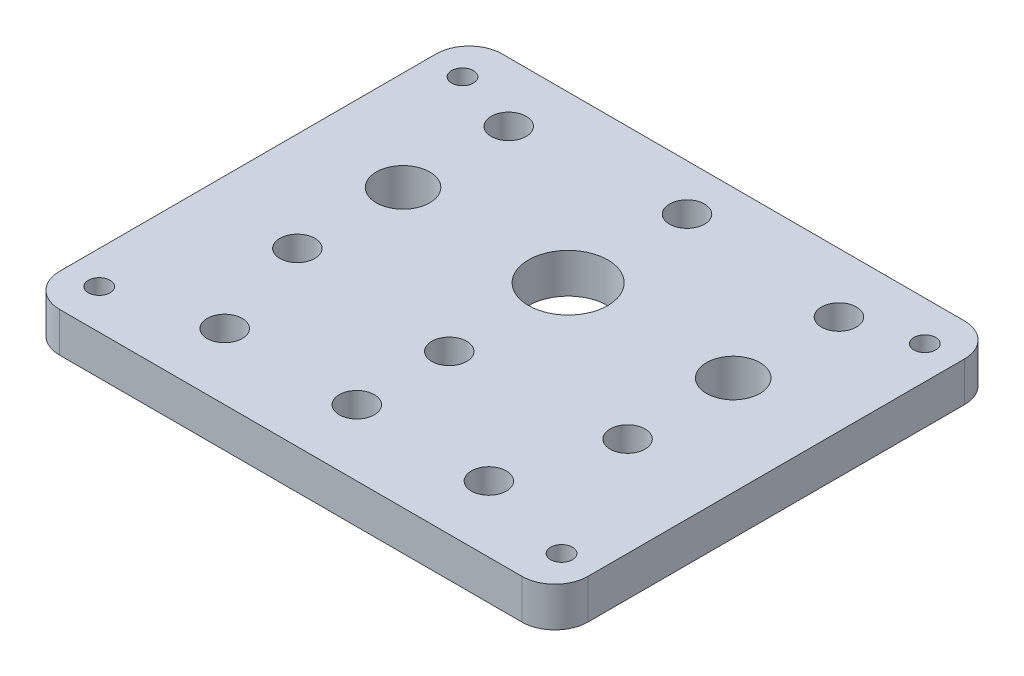
ISO-10303-21;
HEADER;
FILE_DESCRIPTION(('STEP AP214'),'2;1');
FILE_NAME('part.step','',(''),(''),'','','');
FILE_SCHEMA(('AUTOMOTIVE_DESIGN { 1 0 10303 214 1 1 1 1 }'));
ENDSEC;
DATA;
#1=APPLICATION_CONTEXT('core data for automotive mechanical design processes');
#2=APPLICATION_PROTOCOL_DEFINITION('international standard','automotive_design',2000,#1);
#3=PRODUCT_CONTEXT('',#1,'mechanical');
#4=PRODUCT('Part','Part','',(#3));
#5=PRODUCT_RELATED_PRODUCT_CATEGORY('part','',(#4));
#6=PRODUCT_DEFINITION_FORMATION('','',#4);
#7=PRODUCT_DEFINITION_CONTEXT('part definition',#1,'design');
#8=PRODUCT_DEFINITION('design','',#6,#7);
#9=PRODUCT_DEFINITION_SHAPE('','',#8);
#10=(LENGTH_UNIT() NAMED_UNIT(*) SI_UNIT(.MILLI.,.METRE.));
#11=(NAMED_UNIT(*) PLANE_ANGLE_UNIT() SI_UNIT($,.RADIAN.));
#12=(NAMED_UNIT(*) SI_UNIT($,.STERADIAN.) SOLID_ANGLE_UNIT());
#13=UNCERTAINTY_MEASURE_WITH_UNIT(LENGTH_MEASURE(1.E-05),#10,'distance_accuracy_value','');
#14=(GEOMETRIC_REPRESENTATION_CONTEXT(3) GLOBAL_UNCERTAINTY_ASSIGNED_CONTEXT((#13)) GLOBAL_UNIT_ASSIGNED_CONTEXT((#10,
#11,#12)) REPRESENTATION_CONTEXT('',''));
#15=CARTESIAN_POINT('',(0.,0.,0.));
#16=DIRECTION('',(0.,0.,1.));
#17=DIRECTION('',(1.,0.,0.));
#18=AXIS2_PLACEMENT_3D('',#15,#16,#17);
#19=CARTESIAN_POINT('',(-102.546018134677,22.2556489595494,93.7921171285356));
#20=DIRECTION('',(0.,1.,0.));
#21=DIRECTION('',(0.,0.,1.));
#22=AXIS2_PLACEMENT_3D('',#19,#20,#21);
#23=PLANE('',#22);
#24=CARTESIAN_POINT('',(-67.5460181346768,22.2556489595494,74.7921171285356));
#25=DIRECTION('',(0.,1.,0.));
#26=DIRECTION('',(0.,0.,1.));
#27=AXIS2_PLACEMENT_3D('',#24,#25,#26);
#28=CIRCLE('',#27,2.65);
#29=CARTESIAN_POINT('',(-67.5460181346768,22.2556489595494,77.4421171285355));
#30=VERTEX_POINT('',#29);
#31=EDGE_CURVE('E265',#30,#30,#28,.F.);
#32=ORIENTED_EDGE('',*,*,#31,.T.);
#33=EDGE_LOOP('',(#32));
#34=FACE_BOUND('',#33,.T.);
#35=CARTESIAN_POINT('',(-32.5460181346768,22.2556489595494,92.7921171285356));
#36=DIRECTION('',(0.,1.,0.));
#37=DIRECTION('',(0.,0.,-1.));
#38=AXIS2_PLACEMENT_3D('',#35,#36,#37);
#39=CIRCLE('',#38,1.65);
#40=CARTESIAN_POINT('',(-32.5460181346768,22.2556489595494,91.1421171285355));
#41=VERTEX_POINT('',#40);
#42=EDGE_CURVE('E244',#41,#41,#39,.T.);
#43=ORIENTED_EDGE('',*,*,#42,.F.);
#44=EDGE_LOOP('',(#43));
#45=FACE_BOUND('',#44,.T.);
#46=CARTESIAN_POINT('',(-47.5460181346768,22.2556489595494,88.7921171285356));
#47=DIRECTION('',(0.,1.,0.));
#48=DIRECTION('',(0.,0.,1.));
#49=AXIS2_PLACEMENT_3D('',#46,#47,#48);
#50=CIRCLE('',#49,2.65);
#51=CARTESIAN_POINT('',(-47.5460181346768,22.2556489595494,91.4421171285355));
#52=VERTEX_POINT('',#51);
#53=EDGE_CURVE('E232',#52,#52,#50,.T.);
#54=ORIENTED_EDGE('',*,*,#53,.F.);
#55=EDGE_LOOP('',(#54));
#56=FACE_BOUND('',#55,.T.);
#57=CARTESIAN_POINT('',(-102.546018134677,22.2556489595494,92.7921171285356));
#58=DIRECTION('',(0.,1.,0.));
#59=DIRECTION('',(0.,0.,1.));
#60=AXIS2_PLACEMENT_3D('',#57,#58,#59);
#61=CIRCLE('',#60,1.65);
#62=CARTESIAN_POINT('',(-102.546018134677,22.2556489595494,94.4421171285355));
#63=VERTEX_POINT('',#62);
#64=EDGE_CURVE('E220',#63,#63,#61,.T.);
#65=ORIENTED_EDGE('',*,*,#64,.F.);
#66=EDGE_LOOP('',(#65));
#67=FACE_BOUND('',#66,.T.);
#68=CARTESIAN_POINT('',(-42.5460181346768,22.2556489595494,40.7921171285355));
#69=DIRECTION('',(0.,1.,0.));
#70=DIRECTION('',(0.,0.,-1.));
#71=AXIS2_PLACEMENT_3D('',#68,#69,#70);
#72=CIRCLE('',#71,2.65);
#73=CARTESIAN_POINT('',(-42.5460181346768,22.2556489595494,38.1421171285355));
#74=VERTEX_POINT('',#73);
#75=EDGE_CURVE('E208',#74,#74,#72,.T.);
#76=ORIENTED_EDGE('',*,*,#75,.F.);
#77=EDGE_LOOP('',(#76));
#78=FACE_BOUND('',#77,.T.);
#79=CARTESIAN_POINT('',(-42.5460181346768,22.2556489595494,56.7921171285355));
#80=DIRECTION('',(0.,1.,0.));
#81=DIRECTION('',(0.,0.,-1.));
#82=AXIS2_PLACEMENT_3D('',#79,#80,#81);
#83=CIRCLE('',#82,4.05);
#84=CARTESIAN_POINT('',(-42.5460181346768,22.2556489595494,52.7421171285355));
#85=VERTEX_POINT('',#84);
#86=EDGE_CURVE('E196',#85,#85,#83,.T.);
#87=ORIENTED_EDGE('',*,*,#86,.F.);
#88=EDGE_LOOP('',(#87));
#89=FACE_BOUND('',#88,.T.);
#90=CARTESIAN_POINT('',(-92.5460181346768,22.2556489595494,40.7921171285355));
#91=DIRECTION('',(0.,1.,0.));
#92=DIRECTION('',(0.,0.,1.));
#93=AXIS2_PLACEMENT_3D('',#90,#91,#92);
#94=CIRCLE('',#93,2.65);
#95=CARTESIAN_POINT('',(-92.5460181346768,22.2556489595494,43.4421171285355));
#96=VERTEX_POINT('',#95);
#97=EDGE_CURVE('E184',#96,#96,#94,.T.);
#98=ORIENTED_EDGE('',*,*,#97,.F.);
#99=EDGE_LOOP('',(#98));
#100=FACE_BOUND('',#99,.T.);
#101=CARTESIAN_POINT('',(-102.546018134677,22.2556489595494,93.7921171285356));
#102=DIRECTION('',(0.,1.,0.));
#103=DIRECTION('',(0.,0.,1.));
#104=AXIS2_PLACEMENT_3D('',#101,#102,#103);
#105=CIRCLE('',#104,5.);
#106=CARTESIAN_POINT('',(-107.546018134677,22.2556489595494,93.7921171285355));
#107=VERTEX_POINT('',#106);
#108=CARTESIAN_POINT('',(-102.546018134677,22.2556489595494,98.7921171285356));
#109=VERTEX_POINT('',#108);
#110=EDGE_CURVE('E147',#107,#109,#105,.T.);
#111=ORIENTED_EDGE('',*,*,#110,.T.);
#112=DIRECTION('',(1.,0.,0.));
#113=VECTOR('',#112,1.);
#114=CARTESIAN_POINT('',(-102.546018134677,22.2556489595494,98.7921171285356));
#115=LINE('',#114,#113);
#116=CARTESIAN_POINT('',(-32.5460181346768,22.2556489595494,98.7921171285356));
#117=VERTEX_POINT('',#116);
#118=EDGE_CURVE('E95',#109,#117,#115,.T.);
#119=ORIENTED_EDGE('',*,*,#118,.T.);
#120=CARTESIAN_POINT('',(-32.5460181346768,22.2556489595494,93.7921171285356));
#121=DIRECTION('',(0.,1.,0.));
#122=DIRECTION('',(0.,0.,1.));
#123=AXIS2_PLACEMENT_3D('',#120,#121,#122);
#124=CIRCLE('',#123,5.);
#125=CARTESIAN_POINT('',(-27.5460181346768,22.2556489595494,93.7921171285355));
#126=VERTEX_POINT('',#125);
#127=EDGE_CURVE('E162',#117,#126,#124,.T.);
#128=ORIENTED_EDGE('',*,*,#127,.T.);
#129=DIRECTION('',(0.,0.,-1.));
#130=VECTOR('',#129,1.);
#131=CARTESIAN_POINT('',(-27.5460181346768,22.2556489595494,36.7921171285356));
#132=LINE('',#131,#130);
#133=CARTESIAN_POINT('',(-27.5460181346768,22.2556489595494,36.7921171285356));
#134=VERTEX_POINT('',#133);
#135=EDGE_CURVE('E175',#126,#134,#132,.T.);
#136=ORIENTED_EDGE('',*,*,#135,.T.);
#137=CARTESIAN_POINT('',(-32.5460181346768,22.2556489595494,36.7921171285355));
#138=DIRECTION('',(0.,1.,0.));
#139=DIRECTION('',(0.,0.,1.));
#140=AXIS2_PLACEMENT_3D('',#137,#138,#139);
#141=CIRCLE('',#140,5.);
#142=CARTESIAN_POINT('',(-32.5460181346768,22.2556489595494,31.7921171285355));
#143=VERTEX_POINT('',#142);
#144=EDGE_CURVE('E114',#134,#143,#141,.T.);
#145=ORIENTED_EDGE('',*,*,#144,.T.);
#146=DIRECTION('',(-1.,0.,0.));
#147=VECTOR('',#146,1.);
#148=CARTESIAN_POINT('',(-102.546018134677,22.2556489595494,31.7921171285355));
#149=LINE('',#148,#147);
#150=CARTESIAN_POINT('',(-102.546018134677,22.2556489595494,31.7921171285355));
#151=VERTEX_POINT('',#150);
#152=EDGE_CURVE('E108',#143,#151,#149,.T.);
#153=ORIENTED_EDGE('',*,*,#152,.T.);
#154=CARTESIAN_POINT('',(-102.546018134677,22.2556489595494,36.7921171285355));
#155=DIRECTION('',(0.,1.,0.));
#156=DIRECTION('',(0.,0.,1.));
#157=AXIS2_PLACEMENT_3D('',#154,#155,#156);
#158=CIRCLE('',#157,5.);
#159=CARTESIAN_POINT('',(-107.546018134677,22.2556489595494,36.7921171285356));
#160=VERTEX_POINT('',#159);
#161=EDGE_CURVE('E112',#151,#160,#158,.T.);
#162=ORIENTED_EDGE('',*,*,#161,.T.);
#163=DIRECTION('',(0.,0.,1.));
#164=VECTOR('',#163,1.);
#165=CARTESIAN_POINT('',(-107.546018134677,22.2556489595494,36.7921171285356));
#166=LINE('',#165,#164);
#167=EDGE_CURVE('E52',#160,#107,#166,.T.);
#168=ORIENTED_EDGE('',*,*,#167,.T.);
#169=EDGE_LOOP('',(#111,#119,#128,#136,#145,#153,#162,#168));
#170=FACE_BOUND('',#169,.T.);
#171=CARTESIAN_POINT('',(-92.5460181346768,22.2556489595494,56.7921171285355));
#172=DIRECTION('',(0.,1.,0.));
#173=DIRECTION('',(0.,0.,1.));
#174=AXIS2_PLACEMENT_3D('',#171,#172,#173);
#175=CIRCLE('',#174,4.05);
#176=CARTESIAN_POINT('',(-92.5460181346768,22.2556489595494,60.8421171285355));
#177=VERTEX_POINT('',#176);
#178=EDGE_CURVE('E136',#177,#177,#175,.T.);
#179=ORIENTED_EDGE('',*,*,#178,.F.);
#180=EDGE_LOOP('',(#179));
#181=FACE_BOUND('',#180,.T.);
#182=CARTESIAN_POINT('',(-92.5460181346768,22.2556489595494,72.7921171285356));
#183=DIRECTION('',(0.,1.,0.));
#184=DIRECTION('',(0.,0.,-1.));
#185=AXIS2_PLACEMENT_3D('',#182,#183,#184);
#186=CIRCLE('',#185,2.65);
#187=CARTESIAN_POINT('',(-92.5460181346768,22.2556489595494,70.1421171285355));
#188=VERTEX_POINT('',#187);
#189=EDGE_CURVE('E190',#188,#188,#186,.T.);
#190=ORIENTED_EDGE('',*,*,#189,.F.);
#191=EDGE_LOOP('',(#190));
#192=FACE_BOUND('',#191,.T.);
#193=CARTESIAN_POINT('',(-42.5460181346768,22.2556489595494,72.7921171285356));
#194=DIRECTION('',(0.,1.,0.));
#195=DIRECTION('',(0.,0.,1.));
#196=AXIS2_PLACEMENT_3D('',#193,#194,#195);
#197=CIRCLE('',#196,2.65);
#198=CARTESIAN_POINT('',(-42.5460181346768,22.2556489595494,75.4421171285355));
#199=VERTEX_POINT('',#198);
#200=EDGE_CURVE('E202',#199,#199,#197,.T.);
#201=ORIENTED_EDGE('',*,*,#200,.F.);
#202=EDGE_LOOP('',(#201));
#203=FACE_BOUND('',#202,.T.);
#204=CARTESIAN_POINT('',(-87.5460181346768,22.2556489595494,88.7921171285356));
#205=DIRECTION('',(0.,1.,0.));
#206=DIRECTION('',(0.,0.,1.));
#207=AXIS2_PLACEMENT_3D('',#204,#205,#206);
#208=CIRCLE('',#207,2.65);
#209=CARTESIAN_POINT('',(-87.5460181346768,22.2556489595494,91.4421171285355));
#210=VERTEX_POINT('',#209);
#211=EDGE_CURVE('E214',#210,#210,#208,.T.);
#212=ORIENTED_EDGE('',*,*,#211,.F.);
#213=EDGE_LOOP('',(#212));
#214=FACE_BOUND('',#213,.T.);
#215=CARTESIAN_POINT('',(-67.5460181346768,22.2556489595494,88.7921171285356));
#216=DIRECTION('',(0.,1.,0.));
#217=DIRECTION('',(0.,0.,1.));
#218=AXIS2_PLACEMENT_3D('',#215,#216,#217);
#219=CIRCLE('',#218,2.65);
#220=CARTESIAN_POINT('',(-67.5460181346768,22.2556489595494,91.4421171285355));
#221=VERTEX_POINT('',#220);
#222=EDGE_CURVE('E226',#221,#221,#219,.T.);
#223=ORIENTED_EDGE('',*,*,#222,.F.);
#224=EDGE_LOOP('',(#223));
#225=FACE_BOUND('',#224,.T.);
#226=CARTESIAN_POINT('',(-102.546018134677,22.2556489595494,37.7921171285355));
#227=DIRECTION('',(0.,1.,0.));
#228=DIRECTION('',(0.,0.,1.));
#229=AXIS2_PLACEMENT_3D('',#226,#227,#228);
#230=CIRCLE('',#229,1.65);
#231=CARTESIAN_POINT('',(-102.546018134677,22.2556489595494,39.4421171285355));
#232=VERTEX_POINT('',#231);
#233=EDGE_CURVE('E238',#232,#232,#230,.T.);
#234=ORIENTED_EDGE('',*,*,#233,.F.);
#235=EDGE_LOOP('',(#234));
#236=FACE_BOUND('',#235,.T.);
#237=CARTESIAN_POINT('',(-32.5460181346768,22.2556489595494,37.7921171285355));
#238=DIRECTION('',(0.,1.,0.));
#239=DIRECTION('',(0.,0.,-1.));
#240=AXIS2_PLACEMENT_3D('',#237,#238,#239);
#241=CIRCLE('',#240,1.65);
#242=CARTESIAN_POINT('',(-32.5460181346768,22.2556489595494,36.1421171285355));
#243=VERTEX_POINT('',#242);
#244=EDGE_CURVE('E250',#243,#243,#241,.T.);
#245=ORIENTED_EDGE('',*,*,#244,.F.);
#246=EDGE_LOOP('',(#245));
#247=FACE_BOUND('',#246,.T.);
#248=CARTESIAN_POINT('',(-67.5460181346768,22.2556489595494,56.7921171285355));
#249=DIRECTION('',(0.,1.,0.));
#250=DIRECTION('',(0.,0.,1.));
#251=AXIS2_PLACEMENT_3D('',#248,#249,#250);
#252=CIRCLE('',#251,6.00000000000001);
#253=CARTESIAN_POINT('',(-67.5460181346768,22.2556489595494,62.7921171285356));
#254=VERTEX_POINT('',#253);
#255=EDGE_CURVE('E259',#254,#254,#252,.T.);
#256=ORIENTED_EDGE('',*,*,#255,.F.);
#257=EDGE_LOOP('',(#256));
#258=FACE_BOUND('',#257,.T.);
#259=CARTESIAN_POINT('',(-67.5460181346768,22.2556489595494,38.7921171285355));
#260=DIRECTION('',(0.,1.,0.));
#261=DIRECTION('',(0.,0.,1.));
#262=AXIS2_PLACEMENT_3D('',#259,#260,#261);
#263=CIRCLE('',#262,2.65);
#264=CARTESIAN_POINT('',(-67.5460181346768,22.2556489595494,41.4421171285355));
#265=VERTEX_POINT('',#264);
#266=EDGE_CURVE('E271',#265,#265,#263,.T.);
#267=ORIENTED_EDGE('',*,*,#266,.F.);
#268=EDGE_LOOP('',(#267));
#269=FACE_BOUND('',#268,.T.);
#270=ADVANCED_FACE('F35',(#34,#45,#56,#67,#78,#89,#100,#170,#181,#192,#203,#214,#225,#236,#247,
#258,#269),#23,.T.);
#271=CARTESIAN_POINT('',(-102.546018134677,16.2556489595494,93.7921171285356));
#272=DIRECTION('',(0.,1.,0.));
#273=DIRECTION('',(0.,0.,1.));
#274=AXIS2_PLACEMENT_3D('',#271,#272,#273);
#275=PLANE('',#274);
#276=CARTESIAN_POINT('',(-67.5460181346768,16.2556489595494,56.7921171285355));
#277=DIRECTION('',(0.,1.,0.));
#278=DIRECTION('',(0.,0.,1.));
#279=AXIS2_PLACEMENT_3D('',#276,#277,#278);
#280=CIRCLE('',#279,6.00000000000001);
#281=CARTESIAN_POINT('',(-67.5460181346768,16.2556489595494,62.7921171285356));
#282=VERTEX_POINT('',#281);
#283=EDGE_CURVE('E256',#282,#282,#280,.F.);
#284=ORIENTED_EDGE('',*,*,#283,.F.);
#285=EDGE_LOOP('',(#284));
#286=FACE_BOUND('',#285,.T.);
#287=CARTESIAN_POINT('',(-32.5460181346768,16.2556489595494,37.7921171285355));
#288=DIRECTION('',(0.,1.,0.));
#289=DIRECTION('',(0.,0.,-1.));
#290=AXIS2_PLACEMENT_3D('',#287,#288,#289);
#291=CIRCLE('',#290,1.65);
#292=CARTESIAN_POINT('',(-32.5460181346768,16.2556489595494,36.1421171285355));
#293=VERTEX_POINT('',#292);
#294=EDGE_CURVE('E253',#293,#293,#291,.T.);
#295=ORIENTED_EDGE('',*,*,#294,.T.);
#296=EDGE_LOOP('',(#295));
#297=FACE_BOUND('',#296,.T.);
#298=CARTESIAN_POINT('',(-32.5460181346768,16.2556489595494,92.7921171285356));
#299=DIRECTION('',(0.,1.,0.));
#300=DIRECTION('',(0.,0.,-1.));
#301=AXIS2_PLACEMENT_3D('',#298,#299,#300);
#302=CIRCLE('',#301,1.65);
#303=CARTESIAN_POINT('',(-32.5460181346768,16.2556489595494,91.1421171285355));
#304=VERTEX_POINT('',#303);
#305=EDGE_CURVE('E247',#304,#304,#302,.T.);
#306=ORIENTED_EDGE('',*,*,#305,.T.);
#307=EDGE_LOOP('',(#306));
#308=FACE_BOUND('',#307,.T.);
#309=CARTESIAN_POINT('',(-102.546018134677,16.2556489595494,37.7921171285355));
#310=DIRECTION('',(0.,1.,0.));
#311=DIRECTION('',(0.,0.,1.));
#312=AXIS2_PLACEMENT_3D('',#309,#310,#311);
#313=CIRCLE('',#312,1.65);
#314=CARTESIAN_POINT('',(-102.546018134677,16.2556489595494,39.4421171285355));
#315=VERTEX_POINT('',#314);
#316=EDGE_CURVE('E241',#315,#315,#313,.T.);
#317=ORIENTED_EDGE('',*,*,#316,.T.);
#318=EDGE_LOOP('',(#317));
#319=FACE_BOUND('',#318,.T.);
#320=CARTESIAN_POINT('',(-47.5460181346768,16.2556489595494,88.7921171285356));
#321=DIRECTION('',(0.,1.,0.));
#322=DIRECTION('',(0.,0.,1.));
#323=AXIS2_PLACEMENT_3D('',#320,#321,#322);
#324=CIRCLE('',#323,2.65);
#325=CARTESIAN_POINT('',(-47.5460181346768,16.2556489595494,91.4421171285355));
#326=VERTEX_POINT('',#325);
#327=EDGE_CURVE('E235',#326,#326,#324,.T.);
#328=ORIENTED_EDGE('',*,*,#327,.T.);
#329=EDGE_LOOP('',(#328));
#330=FACE_BOUND('',#329,.T.);
#331=CARTESIAN_POINT('',(-67.5460181346768,16.2556489595494,88.7921171285356));
#332=DIRECTION('',(0.,1.,0.));
#333=DIRECTION('',(0.,0.,1.));
#334=AXIS2_PLACEMENT_3D('',#331,#332,#333);
#335=CIRCLE('',#334,2.65);
#336=CARTESIAN_POINT('',(-67.5460181346768,16.2556489595494,91.4421171285355));
#337=VERTEX_POINT('',#336);
#338=EDGE_CURVE('E229',#337,#337,#335,.T.);
#339=ORIENTED_EDGE('',*,*,#338,.T.);
#340=EDGE_LOOP('',(#339));
#341=FACE_BOUND('',#340,.T.);
#342=CARTESIAN_POINT('',(-102.546018134677,16.2556489595494,92.7921171285356));
#343=DIRECTION('',(0.,1.,0.));
#344=DIRECTION('',(0.,0.,1.));
#345=AXIS2_PLACEMENT_3D('',#342,#343,#344);
#346=CIRCLE('',#345,1.65);
#347=CARTESIAN_POINT('',(-102.546018134677,16.2556489595494,94.4421171285355));
#348=VERTEX_POINT('',#347);
#349=EDGE_CURVE('E223',#348,#348,#346,.T.);
#350=ORIENTED_EDGE('',*,*,#349,.T.);
#351=EDGE_LOOP('',(#350));
#352=FACE_BOUND('',#351,.T.);
#353=CARTESIAN_POINT('',(-87.5460181346768,16.2556489595494,88.7921171285356));
#354=DIRECTION('',(0.,1.,0.));
#355=DIRECTION('',(0.,0.,1.));
#356=AXIS2_PLACEMENT_3D('',#353,#354,#355);
#357=CIRCLE('',#356,2.65);
#358=CARTESIAN_POINT('',(-87.5460181346768,16.2556489595494,91.4421171285355));
#359=VERTEX_POINT('',#358);
#360=EDGE_CURVE('E217',#359,#359,#357,.T.);
#361=ORIENTED_EDGE('',*,*,#360,.T.);
#362=EDGE_LOOP('',(#361));
#363=FACE_BOUND('',#362,.T.);
#364=CARTESIAN_POINT('',(-42.5460181346768,16.2556489595494,40.7921171285355));
#365=DIRECTION('',(0.,1.,0.));
#366=DIRECTION('',(0.,0.,-1.));
#367=AXIS2_PLACEMENT_3D('',#364,#365,#366);
#368=CIRCLE('',#367,2.65);
#369=CARTESIAN_POINT('',(-42.5460181346768,16.2556489595494,38.1421171285355));
#370=VERTEX_POINT('',#369);
#371=EDGE_CURVE('E211',#370,#370,#368,.T.);
#372=ORIENTED_EDGE('',*,*,#371,.T.);
#373=EDGE_LOOP('',(#372));
#374=FACE_BOUND('',#373,.T.);
#375=CARTESIAN_POINT('',(-42.5460181346768,16.2556489595494,72.7921171285356));
#376=DIRECTION('',(0.,1.,0.));
#377=DIRECTION('',(0.,0.,1.));
#378=AXIS2_PLACEMENT_3D('',#375,#376,#377);
#379=CIRCLE('',#378,2.65);
#380=CARTESIAN_POINT('',(-42.5460181346768,16.2556489595494,75.4421171285355));
#381=VERTEX_POINT('',#380);
#382=EDGE_CURVE('E205',#381,#381,#379,.T.);
#383=ORIENTED_EDGE('',*,*,#382,.T.);
#384=EDGE_LOOP('',(#383));
#385=FACE_BOUND('',#384,.T.);
#386=CARTESIAN_POINT('',(-42.5460181346768,16.2556489595494,56.7921171285355));
#387=DIRECTION('',(0.,1.,0.));
#388=DIRECTION('',(0.,0.,-1.));
#389=AXIS2_PLACEMENT_3D('',#386,#387,#388);
#390=CIRCLE('',#389,4.05);
#391=CARTESIAN_POINT('',(-42.5460181346768,16.2556489595494,52.7421171285355));
#392=VERTEX_POINT('',#391);
#393=EDGE_CURVE('E199',#392,#392,#390,.T.);
#394=ORIENTED_EDGE('',*,*,#393,.T.);
#395=EDGE_LOOP('',(#394));
#396=FACE_BOUND('',#395,.T.);
#397=CARTESIAN_POINT('',(-92.5460181346768,16.2556489595494,72.7921171285356));
#398=DIRECTION('',(0.,1.,0.));
#399=DIRECTION('',(0.,0.,-1.));
#400=AXIS2_PLACEMENT_3D('',#397,#398,#399);
#401=CIRCLE('',#400,2.65);
#402=CARTESIAN_POINT('',(-92.5460181346768,16.2556489595494,70.1421171285355));
#403=VERTEX_POINT('',#402);
#404=EDGE_CURVE('E193',#403,#403,#401,.T.);
#405=ORIENTED_EDGE('',*,*,#404,.T.);
#406=EDGE_LOOP('',(#405));
#407=FACE_BOUND('',#406,.T.);
#408=CARTESIAN_POINT('',(-92.5460181346768,16.2556489595494,40.7921171285355));
#409=DIRECTION('',(0.,1.,0.));
#410=DIRECTION('',(0.,0.,1.));
#411=AXIS2_PLACEMENT_3D('',#408,#409,#410);
#412=CIRCLE('',#411,2.65);
#413=CARTESIAN_POINT('',(-92.5460181346768,16.2556489595494,43.4421171285355));
#414=VERTEX_POINT('',#413);
#415=EDGE_CURVE('E187',#414,#414,#412,.T.);
#416=ORIENTED_EDGE('',*,*,#415,.T.);
#417=EDGE_LOOP('',(#416));
#418=FACE_BOUND('',#417,.T.);
#419=CARTESIAN_POINT('',(-92.5460181346768,16.2556489595494,56.7921171285355));
#420=DIRECTION('',(0.,1.,0.));
#421=DIRECTION('',(0.,0.,1.));
#422=AXIS2_PLACEMENT_3D('',#419,#420,#421);
#423=CIRCLE('',#422,4.05);
#424=CARTESIAN_POINT('',(-92.5460181346768,16.2556489595494,60.8421171285355));
#425=VERTEX_POINT('',#424);
#426=EDGE_CURVE('E181',#425,#425,#423,.T.);
#427=ORIENTED_EDGE('',*,*,#426,.T.);
#428=EDGE_LOOP('',(#427));
#429=FACE_BOUND('',#428,.T.);
#430=CARTESIAN_POINT('',(-102.546018134677,16.2556489595494,93.7921171285356));
#431=DIRECTION('',(0.,1.,0.));
#432=DIRECTION('',(0.,0.,1.));
#433=AXIS2_PLACEMENT_3D('',#430,#431,#432);
#434=CIRCLE('',#433,5.);
#435=CARTESIAN_POINT('',(-107.546018134677,16.2556489595494,93.7921171285355));
#436=VERTEX_POINT('',#435);
#437=CARTESIAN_POINT('',(-102.546018134677,16.2556489595494,98.7921171285356));
#438=VERTEX_POINT('',#437);
#439=EDGE_CURVE('E132',#436,#438,#434,.T.);
#440=ORIENTED_EDGE('',*,*,#439,.F.);
#441=DIRECTION('',(0.,0.,1.));
#442=VECTOR('',#441,1.);
#443=CARTESIAN_POINT('',(-107.546018134677,16.2556489595494,36.7921171285356));
#444=LINE('',#443,#442);
#445=CARTESIAN_POINT('',(-107.546018134677,16.2556489595494,36.7921171285356));
#446=VERTEX_POINT('',#445);
#447=EDGE_CURVE('E87',#446,#436,#444,.T.);
#448=ORIENTED_EDGE('',*,*,#447,.F.);
#449=CARTESIAN_POINT('',(-102.546018134677,16.2556489595494,36.7921171285355));
#450=DIRECTION('',(0.,1.,0.));
#451=DIRECTION('',(0.,0.,1.));
#452=AXIS2_PLACEMENT_3D('',#449,#450,#451);
#453=CIRCLE('',#452,5.);
#454=CARTESIAN_POINT('',(-102.546018134677,16.2556489595494,31.7921171285355));
#455=VERTEX_POINT('',#454);
#456=EDGE_CURVE('E81',#455,#446,#453,.T.);
#457=ORIENTED_EDGE('',*,*,#456,.F.);
#458=DIRECTION('',(-1.,0.,0.));
#459=VECTOR('',#458,1.);
#460=CARTESIAN_POINT('',(-102.546018134677,16.2556489595494,31.7921171285355));
#461=LINE('',#460,#459);
#462=CARTESIAN_POINT('',(-32.5460181346768,16.2556489595494,31.7921171285355));
#463=VERTEX_POINT('',#462);
#464=EDGE_CURVE('E122',#463,#455,#461,.T.);
#465=ORIENTED_EDGE('',*,*,#464,.F.);
#466=CARTESIAN_POINT('',(-32.5460181346768,16.2556489595494,36.7921171285355));
#467=DIRECTION('',(0.,1.,0.));
#468=DIRECTION('',(0.,0.,1.));
#469=AXIS2_PLACEMENT_3D('',#466,#467,#468);
#470=CIRCLE('',#469,5.);
#471=CARTESIAN_POINT('',(-27.5460181346768,16.2556489595494,36.7921171285356));
#472=VERTEX_POINT('',#471);
#473=EDGE_CURVE('E142',#472,#463,#470,.T.);
#474=ORIENTED_EDGE('',*,*,#473,.F.);
#475=DIRECTION('',(0.,0.,-1.));
#476=VECTOR('',#475,1.);
#477=CARTESIAN_POINT('',(-27.5460181346768,16.2556489595494,36.7921171285356));
#478=LINE('',#477,#476);
#479=CARTESIAN_POINT('',(-27.5460181346768,16.2556489595494,93.7921171285355));
#480=VERTEX_POINT('',#479);
#481=EDGE_CURVE('E140',#480,#472,#478,.T.);
#482=ORIENTED_EDGE('',*,*,#481,.F.);
#483=CARTESIAN_POINT('',(-32.5460181346768,16.2556489595494,93.7921171285356));
#484=DIRECTION('',(0.,1.,0.));
#485=DIRECTION('',(0.,0.,1.));
#486=AXIS2_PLACEMENT_3D('',#483,#484,#485);
#487=CIRCLE('',#486,5.);
#488=CARTESIAN_POINT('',(-32.5460181346768,16.2556489595494,98.7921171285356));
#489=VERTEX_POINT('',#488);
#490=EDGE_CURVE('E138',#489,#480,#487,.T.);
#491=ORIENTED_EDGE('',*,*,#490,.F.);
#492=DIRECTION('',(1.,0.,0.));
#493=VECTOR('',#492,1.);
#494=CARTESIAN_POINT('',(-102.546018134677,16.2556489595494,98.7921171285356));
#495=LINE('',#494,#493);
#496=EDGE_CURVE('E135',#438,#489,#495,.T.);
#497=ORIENTED_EDGE('',*,*,#496,.F.);
#498=EDGE_LOOP('',(#440,#448,#457,#465,#474,#482,#491,#497));
#499=FACE_BOUND('',#498,.T.);
#500=CARTESIAN_POINT('',(-67.5460181346768,16.2556489595494,74.7921171285356));
#501=DIRECTION('',(0.,1.,0.));
#502=DIRECTION('',(0.,0.,1.));
#503=AXIS2_PLACEMENT_3D('',#500,#501,#502);
#504=CIRCLE('',#503,2.65);
#505=CARTESIAN_POINT('',(-67.5460181346768,16.2556489595494,77.4421171285355));
#506=VERTEX_POINT('',#505);
#507=EDGE_CURVE('E268',#506,#506,#504,.F.);
#508=ORIENTED_EDGE('',*,*,#507,.F.);
#509=EDGE_LOOP('',(#508));
#510=FACE_BOUND('',#509,.T.);
#511=CARTESIAN_POINT('',(-67.5460181346768,16.2556489595494,38.7921171285355));
#512=DIRECTION('',(0.,1.,0.));
#513=DIRECTION('',(0.,0.,1.));
#514=AXIS2_PLACEMENT_3D('',#511,#512,#513);
#515=CIRCLE('',#514,2.65);
#516=CARTESIAN_POINT('',(-67.5460181346768,16.2556489595494,41.4421171285355));
#517=VERTEX_POINT('',#516);
#518=EDGE_CURVE('E262',#517,#517,#515,.T.);
#519=ORIENTED_EDGE('',*,*,#518,.T.);
#520=EDGE_LOOP('',(#519));
#521=FACE_BOUND('',#520,.T.);
#522=ADVANCED_FACE('F166',(#286,#297,#308,#319,#330,#341,#352,#363,#374,#385,#396,#407,#418,
#429,#499,#510,#521),#275,.F.);
#523=CARTESIAN_POINT('',(-102.546018134677,22.2556489595494,93.7921171285356));
#524=DIRECTION('',(0.,-1.,0.));
#525=DIRECTION('',(0.,0.,-1.));
#526=AXIS2_PLACEMENT_3D('',#523,#524,#525);
#527=CYLINDRICAL_SURFACE('',#526,5.);
#528=ORIENTED_EDGE('',*,*,#439,.T.);
#529=DIRECTION('',(0.,-1.,0.));
#530=VECTOR('',#529,1.);
#531=CARTESIAN_POINT('',(-102.546018134677,22.2556489595494,98.7921171285356));
#532=LINE('',#531,#530);
#533=EDGE_CURVE('E11',#109,#438,#532,.T.);
#534=ORIENTED_EDGE('',*,*,#533,.F.);
#535=ORIENTED_EDGE('',*,*,#110,.F.);
#536=DIRECTION('',(0.,-1.,0.));
#537=VECTOR('',#536,1.);
#538=CARTESIAN_POINT('',(-107.546018134677,22.2556489595494,93.7921171285355));
#539=LINE('',#538,#537);
#540=EDGE_CURVE('E128',#107,#436,#539,.T.);
#541=ORIENTED_EDGE('',*,*,#540,.T.);
#542=EDGE_LOOP('',(#528,#534,#535,#541));
#543=FACE_BOUND('',#542,.T.);
#544=ADVANCED_FACE('F37',(#543),#527,.T.);
#545=CARTESIAN_POINT('',(-102.546018134677,22.2556489595494,98.7921171285356));
#546=DIRECTION('',(0.,0.,-1.));
#547=DIRECTION('',(-1.,0.,0.));
#548=AXIS2_PLACEMENT_3D('',#545,#546,#547);
#549=PLANE('',#548);
#550=ORIENTED_EDGE('',*,*,#496,.T.);
#551=DIRECTION('',(0.,-1.,0.));
#552=VECTOR('',#551,1.);
#553=CARTESIAN_POINT('',(-32.5460181346768,22.2556489595494,98.7921171285356));
#554=LINE('',#553,#552);
#555=EDGE_CURVE('E44',#117,#489,#554,.T.);
#556=ORIENTED_EDGE('',*,*,#555,.F.);
#557=ORIENTED_EDGE('',*,*,#118,.F.);
#558=ORIENTED_EDGE('',*,*,#533,.T.);
#559=EDGE_LOOP('',(#550,#556,#557,#558));
#560=FACE_BOUND('',#559,.T.);
#561=ADVANCED_FACE('F310',(#560),#549,.F.);
#562=CARTESIAN_POINT('',(-32.5460181346768,22.2556489595494,93.7921171285356));
#563=DIRECTION('',(0.,-1.,0.));
#564=DIRECTION('',(0.,0.,-1.));
#565=AXIS2_PLACEMENT_3D('',#562,#563,#564);
#566=CYLINDRICAL_SURFACE('',#565,5.);
#567=ORIENTED_EDGE('',*,*,#490,.T.);
#568=DIRECTION('',(0.,-1.,0.));
#569=VECTOR('',#568,1.);
#570=CARTESIAN_POINT('',(-27.5460181346768,22.2556489595494,93.7921171285355));
#571=LINE('',#570,#569);
#572=EDGE_CURVE('E154',#126,#480,#571,.T.);
#573=ORIENTED_EDGE('',*,*,#572,.F.);
#574=ORIENTED_EDGE('',*,*,#127,.F.);
#575=ORIENTED_EDGE('',*,*,#555,.T.);
#576=EDGE_LOOP('',(#567,#573,#574,#575));
#577=FACE_BOUND('',#576,.T.);
#578=ADVANCED_FACE('F160',(#577),#566,.T.);
#579=CARTESIAN_POINT('',(-27.5460181346768,22.2556489595494,36.7921171285356));
#580=DIRECTION('',(-1.,0.,0.));
#581=DIRECTION('',(0.,0.,1.));
#582=AXIS2_PLACEMENT_3D('',#579,#580,#581);
#583=PLANE('',#582);
#584=ORIENTED_EDGE('',*,*,#481,.T.);
#585=DIRECTION('',(0.,-1.,0.));
#586=VECTOR('',#585,1.);
#587=CARTESIAN_POINT('',(-27.5460181346768,22.2556489595494,36.7921171285356));
#588=LINE('',#587,#586);
#589=EDGE_CURVE('E151',#134,#472,#588,.T.);
#590=ORIENTED_EDGE('',*,*,#589,.F.);
#591=ORIENTED_EDGE('',*,*,#135,.F.);
#592=ORIENTED_EDGE('',*,*,#572,.T.);
#593=EDGE_LOOP('',(#584,#590,#591,#592));
#594=FACE_BOUND('',#593,.T.);
#595=ADVANCED_FACE('F171',(#594),#583,.F.);
#596=CARTESIAN_POINT('',(-32.5460181346768,22.2556489595494,36.7921171285355));
#597=DIRECTION('',(0.,-1.,0.));
#598=DIRECTION('',(0.,0.,-1.));
#599=AXIS2_PLACEMENT_3D('',#596,#597,#598);
#600=CYLINDRICAL_SURFACE('',#599,5.);
#601=ORIENTED_EDGE('',*,*,#473,.T.);
#602=DIRECTION('',(0.,-1.,0.));
#603=VECTOR('',#602,1.);
#604=CARTESIAN_POINT('',(-32.5460181346768,22.2556489595494,31.7921171285355));
#605=LINE('',#604,#603);
#606=EDGE_CURVE('E123',#143,#463,#605,.T.);
#607=ORIENTED_EDGE('',*,*,#606,.F.);
#608=ORIENTED_EDGE('',*,*,#144,.F.);
#609=ORIENTED_EDGE('',*,*,#589,.T.);
#610=EDGE_LOOP('',(#601,#607,#608,#609));
#611=FACE_BOUND('',#610,.T.);
#612=ADVANCED_FACE('F174',(#611),#600,.T.);
#613=CARTESIAN_POINT('',(-102.546018134677,22.2556489595494,31.7921171285355));
#614=DIRECTION('',(0.,0.,1.));
#615=DIRECTION('',(1.,0.,0.));
#616=AXIS2_PLACEMENT_3D('',#613,#614,#615);
#617=PLANE('',#616);
#618=ORIENTED_EDGE('',*,*,#464,.T.);
#619=DIRECTION('',(0.,-1.,0.));
#620=VECTOR('',#619,1.);
#621=CARTESIAN_POINT('',(-102.546018134677,22.2556489595494,31.7921171285355));
#622=LINE('',#621,#620);
#623=EDGE_CURVE('E119',#151,#455,#622,.T.);
#624=ORIENTED_EDGE('',*,*,#623,.F.);
#625=ORIENTED_EDGE('',*,*,#152,.F.);
#626=ORIENTED_EDGE('',*,*,#606,.T.);
#627=EDGE_LOOP('',(#618,#624,#625,#626));
#628=FACE_BOUND('',#627,.T.);
#629=ADVANCED_FACE('F120',(#628),#617,.F.);
#630=CARTESIAN_POINT('',(-102.546018134677,22.2556489595494,36.7921171285355));
#631=DIRECTION('',(0.,-1.,0.));
#632=DIRECTION('',(0.,0.,-1.));
#633=AXIS2_PLACEMENT_3D('',#630,#631,#632);
#634=CYLINDRICAL_SURFACE('',#633,5.);
#635=ORIENTED_EDGE('',*,*,#456,.T.);
#636=DIRECTION('',(0.,-1.,0.));
#637=VECTOR('',#636,1.);
#638=CARTESIAN_POINT('',(-107.546018134677,22.2556489595494,36.7921171285356));
#639=LINE('',#638,#637);
#640=EDGE_CURVE('E124',#160,#446,#639,.T.);
#641=ORIENTED_EDGE('',*,*,#640,.F.);
#642=ORIENTED_EDGE('',*,*,#161,.F.);
#643=ORIENTED_EDGE('',*,*,#623,.T.);
#644=EDGE_LOOP('',(#635,#641,#642,#643));
#645=FACE_BOUND('',#644,.T.);
#646=ADVANCED_FACE('F126',(#645),#634,.T.);
#647=CARTESIAN_POINT('',(-107.546018134677,22.2556489595494,36.7921171285356));
#648=DIRECTION('',(1.,0.,0.));
#649=DIRECTION('',(0.,0.,-1.));
#650=AXIS2_PLACEMENT_3D('',#647,#648,#649);
#651=PLANE('',#650);
#652=ORIENTED_EDGE('',*,*,#447,.T.);
#653=ORIENTED_EDGE('',*,*,#540,.F.);
#654=ORIENTED_EDGE('',*,*,#167,.F.);
#655=ORIENTED_EDGE('',*,*,#640,.T.);
#656=EDGE_LOOP('',(#652,#653,#654,#655));
#657=FACE_BOUND('',#656,.T.);
#658=ADVANCED_FACE('F298',(#657),#651,.F.);
#659=CARTESIAN_POINT('',(-92.5460181346768,22.2556489595494,56.7921171285355));
#660=DIRECTION('',(0.,-1.,0.));
#661=DIRECTION('',(0.,0.,-1.));
#662=AXIS2_PLACEMENT_3D('',#659,#660,#661);
#663=CYLINDRICAL_SURFACE('',#662,4.05);
#664=ORIENTED_EDGE('',*,*,#178,.T.);
#665=EDGE_LOOP('',(#664));
#666=FACE_BOUND('',#665,.T.);
#667=ORIENTED_EDGE('',*,*,#426,.F.);
#668=EDGE_LOOP('',(#667));
#669=FACE_BOUND('',#668,.T.);
#670=ADVANCED_FACE('F295',(#666,#669),#663,.F.);
#671=CARTESIAN_POINT('',(-92.5460181346768,22.2556489595494,40.7921171285355));
#672=DIRECTION('',(0.,-1.,0.));
#673=DIRECTION('',(0.,0.,-1.));
#674=AXIS2_PLACEMENT_3D('',#671,#672,#673);
#675=CYLINDRICAL_SURFACE('',#674,2.65);
#676=ORIENTED_EDGE('',*,*,#97,.T.);
#677=EDGE_LOOP('',(#676));
#678=FACE_BOUND('',#677,.T.);
#679=ORIENTED_EDGE('',*,*,#415,.F.);
#680=EDGE_LOOP('',(#679));
#681=FACE_BOUND('',#680,.T.);
#682=ADVANCED_FACE('F440',(#678,#681),#675,.F.);
#683=CARTESIAN_POINT('',(-92.5460181346768,22.2556489595494,72.7921171285356));
#684=DIRECTION('',(0.,-1.,0.));
#685=DIRECTION('',(0.,0.,-1.));
#686=AXIS2_PLACEMENT_3D('',#683,#684,#685);
#687=CYLINDRICAL_SURFACE('',#686,2.65);
#688=ORIENTED_EDGE('',*,*,#189,.T.);
#689=EDGE_LOOP('',(#688));
#690=FACE_BOUND('',#689,.T.);
#691=ORIENTED_EDGE('',*,*,#404,.F.);
#692=EDGE_LOOP('',(#691));
#693=FACE_BOUND('',#692,.T.);
#694=ADVANCED_FACE('F432',(#690,#693),#687,.F.);
#695=CARTESIAN_POINT('',(-42.5460181346768,22.2556489595494,56.7921171285355));
#696=DIRECTION('',(0.,-1.,0.));
#697=DIRECTION('',(0.,0.,-1.));
#698=AXIS2_PLACEMENT_3D('',#695,#696,#697);
#699=CYLINDRICAL_SURFACE('',#698,4.05);
#700=ORIENTED_EDGE('',*,*,#86,.T.);
#701=EDGE_LOOP('',(#700));
#702=FACE_BOUND('',#701,.T.);
#703=ORIENTED_EDGE('',*,*,#393,.F.);
#704=EDGE_LOOP('',(#703));
#705=FACE_BOUND('',#704,.T.);
#706=ADVANCED_FACE('F424',(#702,#705),#699,.F.);
#707=CARTESIAN_POINT('',(-42.5460181346768,22.2556489595494,72.7921171285356));
#708=DIRECTION('',(0.,-1.,0.));
#709=DIRECTION('',(0.,0.,-1.));
#710=AXIS2_PLACEMENT_3D('',#707,#708,#709);
#711=CYLINDRICAL_SURFACE('',#710,2.65);
#712=ORIENTED_EDGE('',*,*,#200,.T.);
#713=EDGE_LOOP('',(#712));
#714=FACE_BOUND('',#713,.T.);
#715=ORIENTED_EDGE('',*,*,#382,.F.);
#716=EDGE_LOOP('',(#715));
#717=FACE_BOUND('',#716,.T.);
#718=ADVANCED_FACE('F416',(#714,#717),#711,.F.);
#719=CARTESIAN_POINT('',(-42.5460181346768,22.2556489595494,40.7921171285355));
#720=DIRECTION('',(0.,-1.,0.));
#721=DIRECTION('',(0.,0.,-1.));
#722=AXIS2_PLACEMENT_3D('',#719,#720,#721);
#723=CYLINDRICAL_SURFACE('',#722,2.65);
#724=ORIENTED_EDGE('',*,*,#75,.T.);
#725=EDGE_LOOP('',(#724));
#726=FACE_BOUND('',#725,.T.);
#727=ORIENTED_EDGE('',*,*,#371,.F.);
#728=EDGE_LOOP('',(#727));
#729=FACE_BOUND('',#728,.T.);
#730=ADVANCED_FACE('F408',(#726,#729),#723,.F.);
#731=CARTESIAN_POINT('',(-87.5460181346768,22.2556489595494,88.7921171285356));
#732=DIRECTION('',(0.,-1.,0.));
#733=DIRECTION('',(0.,0.,-1.));
#734=AXIS2_PLACEMENT_3D('',#731,#732,#733);
#735=CYLINDRICAL_SURFACE('',#734,2.65);
#736=ORIENTED_EDGE('',*,*,#211,.T.);
#737=EDGE_LOOP('',(#736));
#738=FACE_BOUND('',#737,.T.);
#739=ORIENTED_EDGE('',*,*,#360,.F.);
#740=EDGE_LOOP('',(#739));
#741=FACE_BOUND('',#740,.T.);
#742=ADVANCED_FACE('F400',(#738,#741),#735,.F.);
#743=CARTESIAN_POINT('',(-102.546018134677,22.2556489595494,92.7921171285356));
#744=DIRECTION('',(0.,-1.,0.));
#745=DIRECTION('',(0.,0.,-1.));
#746=AXIS2_PLACEMENT_3D('',#743,#744,#745);
#747=CYLINDRICAL_SURFACE('',#746,1.65);
#748=ORIENTED_EDGE('',*,*,#64,.T.);
#749=EDGE_LOOP('',(#748));
#750=FACE_BOUND('',#749,.T.);
#751=ORIENTED_EDGE('',*,*,#349,.F.);
#752=EDGE_LOOP('',(#751));
#753=FACE_BOUND('',#752,.T.);
#754=ADVANCED_FACE('F392',(#750,#753),#747,.F.);
#755=CARTESIAN_POINT('',(-67.5460181346768,22.2556489595494,88.7921171285356));
#756=DIRECTION('',(0.,-1.,0.));
#757=DIRECTION('',(0.,0.,-1.));
#758=AXIS2_PLACEMENT_3D('',#755,#756,#757);
#759=CYLINDRICAL_SURFACE('',#758,2.65);
#760=ORIENTED_EDGE('',*,*,#222,.T.);
#761=EDGE_LOOP('',(#760));
#762=FACE_BOUND('',#761,.T.);
#763=ORIENTED_EDGE('',*,*,#338,.F.);
#764=EDGE_LOOP('',(#763));
#765=FACE_BOUND('',#764,.T.);
#766=ADVANCED_FACE('F384',(#762,#765),#759,.F.);
#767=CARTESIAN_POINT('',(-47.5460181346768,22.2556489595494,88.7921171285356));
#768=DIRECTION('',(0.,-1.,0.));
#769=DIRECTION('',(0.,0.,-1.));
#770=AXIS2_PLACEMENT_3D('',#767,#768,#769);
#771=CYLINDRICAL_SURFACE('',#770,2.65);
#772=ORIENTED_EDGE('',*,*,#53,.T.);
#773=EDGE_LOOP('',(#772));
#774=FACE_BOUND('',#773,.T.);
#775=ORIENTED_EDGE('',*,*,#327,.F.);
#776=EDGE_LOOP('',(#775));
#777=FACE_BOUND('',#776,.T.);
#778=ADVANCED_FACE('F376',(#774,#777),#771,.F.);
#779=CARTESIAN_POINT('',(-102.546018134677,22.2556489595494,37.7921171285355));
#780=DIRECTION('',(0.,-1.,0.));
#781=DIRECTION('',(0.,0.,-1.));
#782=AXIS2_PLACEMENT_3D('',#779,#780,#781);
#783=CYLINDRICAL_SURFACE('',#782,1.65);
#784=ORIENTED_EDGE('',*,*,#233,.T.);
#785=EDGE_LOOP('',(#784));
#786=FACE_BOUND('',#785,.T.);
#787=ORIENTED_EDGE('',*,*,#316,.F.);
#788=EDGE_LOOP('',(#787));
#789=FACE_BOUND('',#788,.T.);
#790=ADVANCED_FACE('F368',(#786,#789),#783,.F.);
#791=CARTESIAN_POINT('',(-32.5460181346768,22.2556489595494,92.7921171285356));
#792=DIRECTION('',(0.,-1.,0.));
#793=DIRECTION('',(0.,0.,-1.));
#794=AXIS2_PLACEMENT_3D('',#791,#792,#793);
#795=CYLINDRICAL_SURFACE('',#794,1.65);
#796=ORIENTED_EDGE('',*,*,#42,.T.);
#797=EDGE_LOOP('',(#796));
#798=FACE_BOUND('',#797,.T.);
#799=ORIENTED_EDGE('',*,*,#305,.F.);
#800=EDGE_LOOP('',(#799));
#801=FACE_BOUND('',#800,.T.);
#802=ADVANCED_FACE('F360',(#798,#801),#795,.F.);
#803=CARTESIAN_POINT('',(-32.5460181346768,22.2556489595494,37.7921171285355));
#804=DIRECTION('',(0.,-1.,0.));
#805=DIRECTION('',(0.,0.,-1.));
#806=AXIS2_PLACEMENT_3D('',#803,#804,#805);
#807=CYLINDRICAL_SURFACE('',#806,1.65);
#808=ORIENTED_EDGE('',*,*,#244,.T.);
#809=EDGE_LOOP('',(#808));
#810=FACE_BOUND('',#809,.T.);
#811=ORIENTED_EDGE('',*,*,#294,.F.);
#812=EDGE_LOOP('',(#811));
#813=FACE_BOUND('',#812,.T.);
#814=ADVANCED_FACE('F352',(#810,#813),#807,.F.);
#815=CARTESIAN_POINT('',(-67.5460181346768,-14.998470768896,56.7921171285355));
#816=DIRECTION('',(0.,1.,0.));
#817=DIRECTION('',(0.,0.,1.));
#818=AXIS2_PLACEMENT_3D('',#815,#816,#817);
#819=CYLINDRICAL_SURFACE('',#818,6.00000000000001);
#820=ORIENTED_EDGE('',*,*,#283,.T.);
#821=EDGE_LOOP('',(#820));
#822=FACE_BOUND('',#821,.T.);
#823=ORIENTED_EDGE('',*,*,#255,.T.);
#824=EDGE_LOOP('',(#823));
#825=FACE_BOUND('',#824,.T.);
#826=ADVANCED_FACE('F338',(#822,#825),#819,.F.);
#827=CARTESIAN_POINT('',(-67.5460181346768,16.2556489595494,74.7921171285356));
#828=DIRECTION('',(0.,1.,0.));
#829=DIRECTION('',(0.,0.,1.));
#830=AXIS2_PLACEMENT_3D('',#827,#828,#829);
#831=CYLINDRICAL_SURFACE('',#830,2.65);
#832=ORIENTED_EDGE('',*,*,#507,.T.);
#833=EDGE_LOOP('',(#832));
#834=FACE_BOUND('',#833,.T.);
#835=ORIENTED_EDGE('',*,*,#31,.F.);
#836=EDGE_LOOP('',(#835));
#837=FACE_BOUND('',#836,.T.);
#838=ADVANCED_FACE('F281',(#834,#837),#831,.F.);
#839=CARTESIAN_POINT('',(-67.5460181346768,16.2556489595494,38.7921171285355));
#840=DIRECTION('',(0.,1.,0.));
#841=DIRECTION('',(0.,0.,1.));
#842=AXIS2_PLACEMENT_3D('',#839,#840,#841);
#843=CYLINDRICAL_SURFACE('',#842,2.65);
#844=ORIENTED_EDGE('',*,*,#518,.F.);
#845=EDGE_LOOP('',(#844));
#846=FACE_BOUND('',#845,.T.);
#847=ORIENTED_EDGE('',*,*,#266,.T.);
#848=EDGE_LOOP('',(#847));
#849=FACE_BOUND('',#848,.T.);
#850=ADVANCED_FACE('F278',(#846,#849),#843,.F.);
#851=CLOSED_SHELL('',(#270,#522,#544,#561,#578,#595,#612,#629,#646,#658,#670,#682,#694,#706,
#718,#730,#742,#754,#766,#778,#790,#802,#814,#826,#838,#850));
#852=MANIFOLD_SOLID_BREP('B2',#851);
#853=ADVANCED_BREP_SHAPE_REPRESENTATION('',(#18,#852),#14);
#854=SHAPE_DEFINITION_REPRESENTATION(#9,#853);
ENDSEC;
END-ISO-10303-21;
